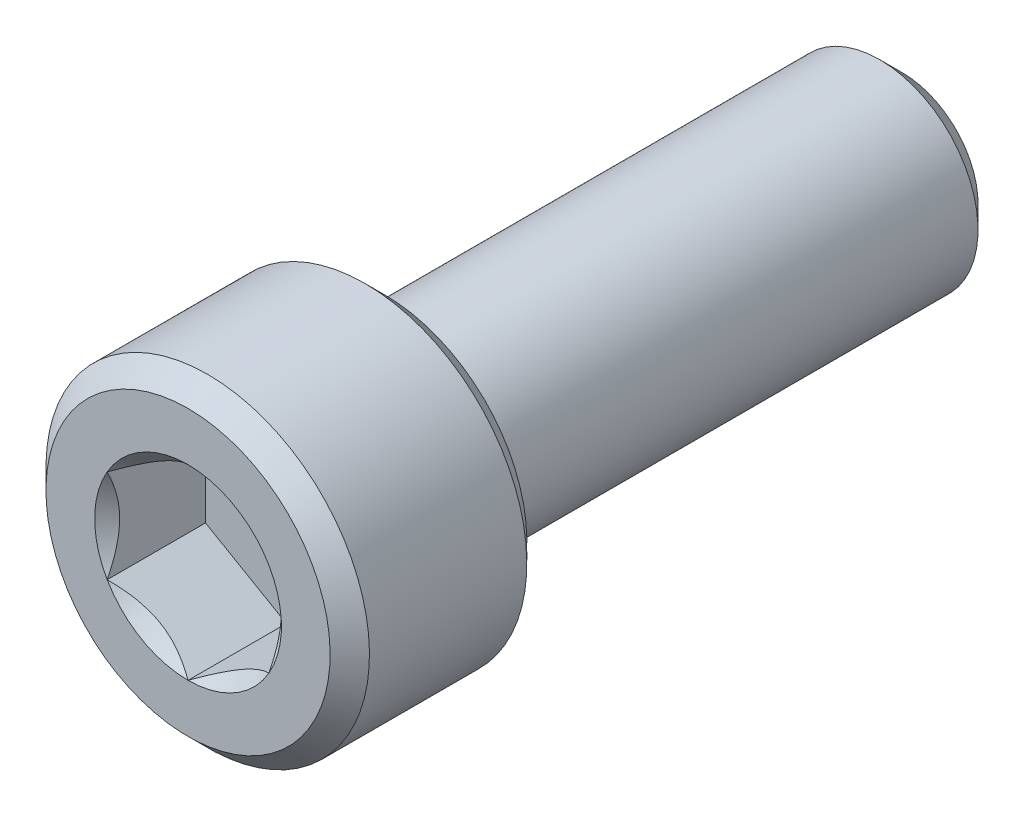
ISO-10303-21;
HEADER;
FILE_DESCRIPTION(('STEP AP214'),'2;1');
FILE_NAME('part.step','',(''),(''),'','','');
FILE_SCHEMA(('AUTOMOTIVE_DESIGN { 1 0 10303 214 1 1 1 1 }'));
ENDSEC;
DATA;
#1=APPLICATION_CONTEXT('core data for automotive mechanical design processes');
#2=APPLICATION_PROTOCOL_DEFINITION('international standard','automotive_design',2000,#1);
#3=PRODUCT_CONTEXT('',#1,'mechanical');
#4=PRODUCT('Part','Part','',(#3));
#5=PRODUCT_RELATED_PRODUCT_CATEGORY('part','',(#4));
#6=PRODUCT_DEFINITION_FORMATION('','',#4);
#7=PRODUCT_DEFINITION_CONTEXT('part definition',#1,'design');
#8=PRODUCT_DEFINITION('design','',#6,#7);
#9=PRODUCT_DEFINITION_SHAPE('','',#8);
#10=(LENGTH_UNIT() NAMED_UNIT(*) SI_UNIT(.MILLI.,.METRE.));
#11=(NAMED_UNIT(*) PLANE_ANGLE_UNIT() SI_UNIT($,.RADIAN.));
#12=(NAMED_UNIT(*) SI_UNIT($,.STERADIAN.) SOLID_ANGLE_UNIT());
#13=UNCERTAINTY_MEASURE_WITH_UNIT(LENGTH_MEASURE(1.E-05),#10,'distance_accuracy_value','');
#14=(GEOMETRIC_REPRESENTATION_CONTEXT(3) GLOBAL_UNCERTAINTY_ASSIGNED_CONTEXT((#13)) GLOBAL_UNIT_ASSIGNED_CONTEXT((#10,
#11,#12)) REPRESENTATION_CONTEXT('',''));
#15=CARTESIAN_POINT('',(0.,0.,0.));
#16=DIRECTION('',(0.,0.,1.));
#17=DIRECTION('',(1.,0.,0.));
#18=AXIS2_PLACEMENT_3D('',#15,#16,#17);
#19=CARTESIAN_POINT('',(0.,1.85737500000001,-8.763));
#20=DIRECTION('',(0.,0.,-1.));
#21=DIRECTION('',(0.,1.,0.));
#22=AXIS2_PLACEMENT_3D('',#19,#20,#21);
#23=PLANE('',#22);
#24=CARTESIAN_POINT('',(0.,0.,-8.76300000000001));
#25=DIRECTION('',(0.,0.,-1.));
#26=DIRECTION('',(0.,1.,0.));
#27=AXIS2_PLACEMENT_3D('',#24,#25,#26);
#28=CIRCLE('',#27,1.85737500000002);
#29=CARTESIAN_POINT('',(0.,1.85737500000001,-8.76300000000001));
#30=VERTEX_POINT('',#29);
#31=EDGE_CURVE('E202',#30,#30,#28,.T.);
#32=ORIENTED_EDGE('',*,*,#31,.T.);
#33=EDGE_LOOP('',(#32));
#34=FACE_BOUND('',#33,.T.);
#35=ADVANCED_FACE('F33',(#34),#23,.T.);
#36=CARTESIAN_POINT('',(0.,0.,8.763));
#37=DIRECTION('',(0.,0.,1.));
#38=DIRECTION('',(0.,-1.,0.));
#39=AXIS2_PLACEMENT_3D('',#36,#37,#38);
#40=PLANE('',#39);
#41=CARTESIAN_POINT('',(0.,0.,8.763));
#42=DIRECTION('',(0.,0.,1.));
#43=DIRECTION('',(1.,0.,0.));
#44=AXIS2_PLACEMENT_3D('',#41,#42,#43);
#45=CIRCLE('',#44,2.29135888084633);
#46=CARTESIAN_POINT('',(0.,-2.29135888084633,8.763));
#47=VERTEX_POINT('',#46);
#48=CARTESIAN_POINT('',(1.98437500000001,-1.14567944042315,8.763));
#49=VERTEX_POINT('',#48);
#50=EDGE_CURVE('E102',#47,#49,#45,.T.);
#51=ORIENTED_EDGE('',*,*,#50,.F.);
#52=CARTESIAN_POINT('',(-1.984375,-1.14567944042316,8.763));
#53=VERTEX_POINT('',#52);
#54=EDGE_CURVE('E92',#53,#47,#45,.T.);
#55=ORIENTED_EDGE('',*,*,#54,.F.);
#56=CARTESIAN_POINT('',(-1.984375,1.14567944042317,8.763));
#57=VERTEX_POINT('',#56);
#58=EDGE_CURVE('E101',#57,#53,#45,.T.);
#59=ORIENTED_EDGE('',*,*,#58,.F.);
#60=CARTESIAN_POINT('',(0.,2.29135888084633,8.763));
#61=VERTEX_POINT('',#60);
#62=EDGE_CURVE('E52',#61,#57,#45,.T.);
#63=ORIENTED_EDGE('',*,*,#62,.F.);
#64=CARTESIAN_POINT('',(1.984375,1.14567944042317,8.763));
#65=VERTEX_POINT('',#64);
#66=EDGE_CURVE('E59',#65,#61,#45,.T.);
#67=ORIENTED_EDGE('',*,*,#66,.F.);
#68=EDGE_CURVE('E130',#49,#65,#45,.T.);
#69=ORIENTED_EDGE('',*,*,#68,.F.);
#70=EDGE_LOOP('',(#51,#55,#59,#63,#67,#69));
#71=FACE_BOUND('',#70,.T.);
#72=CARTESIAN_POINT('',(0.,0.,8.763));
#73=DIRECTION('',(0.,0.,-1.));
#74=DIRECTION('',(0.,1.,0.));
#75=AXIS2_PLACEMENT_3D('',#72,#73,#74);
#76=CIRCLE('',#75,3.48615);
#77=CARTESIAN_POINT('',(0.,3.48614999999999,8.763));
#78=VERTEX_POINT('',#77);
#79=EDGE_CURVE('E46',#78,#78,#76,.T.);
#80=ORIENTED_EDGE('',*,*,#79,.F.);
#81=EDGE_LOOP('',(#80));
#82=FACE_BOUND('',#81,.T.);
#83=ADVANCED_FACE('F128',(#71,#82),#40,.T.);
#84=CARTESIAN_POINT('',(0.,0.,8.2804));
#85=DIRECTION('',(0.,0.,-1.));
#86=DIRECTION('',(0.,1.,0.));
#87=AXIS2_PLACEMENT_3D('',#84,#85,#86);
#88=CONICAL_SURFACE('',#87,3.96875,0.785398163397448);
#89=ORIENTED_EDGE('',*,*,#79,.T.);
#90=EDGE_LOOP('',(#89));
#91=FACE_BOUND('',#90,.T.);
#92=CARTESIAN_POINT('',(0.,0.,8.2804));
#93=DIRECTION('',(0.,0.,-1.));
#94=DIRECTION('',(0.,1.,0.));
#95=AXIS2_PLACEMENT_3D('',#92,#93,#94);
#96=CIRCLE('',#95,3.96875);
#97=CARTESIAN_POINT('',(0.,3.96874999999999,8.2804));
#98=VERTEX_POINT('',#97);
#99=EDGE_CURVE('E221',#98,#98,#96,.T.);
#100=ORIENTED_EDGE('',*,*,#99,.F.);
#101=EDGE_LOOP('',(#100));
#102=FACE_BOUND('',#101,.T.);
#103=ADVANCED_FACE('F199',(#91,#102),#88,.T.);
#104=CARTESIAN_POINT('',(0.,0.,-8.763));
#105=DIRECTION('',(0.,0.,-1.));
#106=DIRECTION('',(0.,1.,0.));
#107=AXIS2_PLACEMENT_3D('',#104,#105,#106);
#108=CYLINDRICAL_SURFACE('',#107,3.96875);
#109=ORIENTED_EDGE('',*,*,#99,.T.);
#110=EDGE_LOOP('',(#109));
#111=FACE_BOUND('',#110,.T.);
#112=CARTESIAN_POINT('',(0.,0.,4.4196));
#113=DIRECTION('',(0.,0.,-1.));
#114=DIRECTION('',(0.,1.,0.));
#115=AXIS2_PLACEMENT_3D('',#112,#113,#114);
#116=CIRCLE('',#115,3.96875);
#117=CARTESIAN_POINT('',(0.,3.96874999999999,4.4196));
#118=VERTEX_POINT('',#117);
#119=EDGE_CURVE('E218',#118,#118,#116,.T.);
#120=ORIENTED_EDGE('',*,*,#119,.F.);
#121=EDGE_LOOP('',(#120));
#122=FACE_BOUND('',#121,.T.);
#123=ADVANCED_FACE('F228',(#111,#122),#108,.T.);
#124=CARTESIAN_POINT('',(0.,0.,3.937));
#125=DIRECTION('',(0.,0.,1.));
#126=DIRECTION('',(0.,-1.,0.));
#127=AXIS2_PLACEMENT_3D('',#124,#125,#126);
#128=CONICAL_SURFACE('',#127,3.48614999999999,0.785398163397455);
#129=ORIENTED_EDGE('',*,*,#119,.T.);
#130=EDGE_LOOP('',(#129));
#131=FACE_BOUND('',#130,.T.);
#132=CARTESIAN_POINT('',(0.,0.,3.937));
#133=DIRECTION('',(0.,0.,-1.));
#134=DIRECTION('',(0.,1.,0.));
#135=AXIS2_PLACEMENT_3D('',#132,#133,#134);
#136=CIRCLE('',#135,3.48614999999999);
#137=CARTESIAN_POINT('',(0.,3.48614999999998,3.937));
#138=VERTEX_POINT('',#137);
#139=EDGE_CURVE('E215',#138,#138,#136,.T.);
#140=ORIENTED_EDGE('',*,*,#139,.F.);
#141=EDGE_LOOP('',(#140));
#142=FACE_BOUND('',#141,.T.);
#143=ADVANCED_FACE('F234',(#131,#142),#128,.T.);
#144=CARTESIAN_POINT('',(0.,3.48614999999998,3.937));
#145=DIRECTION('',(0.,0.,-1.));
#146=DIRECTION('',(0.,1.,0.));
#147=AXIS2_PLACEMENT_3D('',#144,#145,#146);
#148=PLANE('',#147);
#149=ORIENTED_EDGE('',*,*,#139,.T.);
#150=EDGE_LOOP('',(#149));
#151=FACE_BOUND('',#150,.T.);
#152=CARTESIAN_POINT('',(0.,0.,3.937));
#153=DIRECTION('',(0.,0.,-1.));
#154=DIRECTION('',(0.,1.,0.));
#155=AXIS2_PLACEMENT_3D('',#152,#153,#154);
#156=CIRCLE('',#155,2.41300000000001);
#157=CARTESIAN_POINT('',(0.,2.41300000000001,3.937));
#158=VERTEX_POINT('',#157);
#159=EDGE_CURVE('E207',#158,#158,#156,.T.);
#160=ORIENTED_EDGE('',*,*,#159,.F.);
#161=EDGE_LOOP('',(#160));
#162=FACE_BOUND('',#161,.T.);
#163=ADVANCED_FACE('F240',(#151,#162),#148,.T.);
#164=CARTESIAN_POINT('',(0.,0.,-8.763));
#165=DIRECTION('',(0.,0.,-1.));
#166=DIRECTION('',(0.,1.,0.));
#167=AXIS2_PLACEMENT_3D('',#164,#165,#166);
#168=CYLINDRICAL_SURFACE('',#167,2.41300000000001);
#169=ORIENTED_EDGE('',*,*,#159,.T.);
#170=EDGE_LOOP('',(#169));
#171=FACE_BOUND('',#170,.T.);
#172=CARTESIAN_POINT('',(0.,0.,-8.20737500000002));
#173=DIRECTION('',(0.,0.,-1.));
#174=DIRECTION('',(0.,1.,0.));
#175=AXIS2_PLACEMENT_3D('',#172,#173,#174);
#176=CIRCLE('',#175,2.41300000000001);
#177=CARTESIAN_POINT('',(0.,2.41300000000001,-8.20737500000002));
#178=VERTEX_POINT('',#177);
#179=EDGE_CURVE('E204',#178,#178,#176,.T.);
#180=ORIENTED_EDGE('',*,*,#179,.F.);
#181=EDGE_LOOP('',(#180));
#182=FACE_BOUND('',#181,.T.);
#183=ADVANCED_FACE('F246',(#171,#182),#168,.T.);
#184=CARTESIAN_POINT('',(0.,0.,-8.76300000000001));
#185=DIRECTION('',(0.,0.,1.));
#186=DIRECTION('',(0.,-1.,0.));
#187=AXIS2_PLACEMENT_3D('',#184,#185,#186);
#188=CONICAL_SURFACE('',#187,1.85737500000002,0.785398163397456);
#189=ORIENTED_EDGE('',*,*,#179,.T.);
#190=EDGE_LOOP('',(#189));
#191=FACE_BOUND('',#190,.T.);
#192=ORIENTED_EDGE('',*,*,#31,.F.);
#193=EDGE_LOOP('',(#192));
#194=FACE_BOUND('',#193,.T.);
#195=ADVANCED_FACE('F252',(#191,#194),#188,.T.);
#196=CARTESIAN_POINT('',(0.,0.,8.763));
#197=DIRECTION('',(0.,0.,1.));
#198=DIRECTION('',(1.,0.,0.));
#199=AXIS2_PLACEMENT_3D('',#196,#197,#198);
#200=CONICAL_SURFACE('',#199,2.29135888084633,0.78539816339745);
#201=ORIENTED_EDGE('',*,*,#50,.T.);
#202=CARTESIAN_POINT('',(-0.000199999999999756,-2.29147435090016,8.76311547878183));
#203=CARTESIAN_POINT('',(0.0680159951668026,-2.25208982772757,8.7237628522639));
#204=CARTESIAN_POINT('',(0.137372685106966,-2.21204672412051,8.68672131044618));
#205=CARTESIAN_POINT('',(0.278798800452187,-2.13039431835551,8.61889885842331));
#206=CARTESIAN_POINT('',(0.350881678736782,-2.08877724917393,8.58815568909174));
#207=CARTESIAN_POINT('',(0.496233397266003,-2.00485839535391,8.5354918888112));
#208=CARTESIAN_POINT('',(0.569465212486937,-1.96257798712286,8.51343887587996));
#209=CARTESIAN_POINT('',(0.717541182594705,-1.87708628592063,8.47946149294387));
#210=CARTESIAN_POINT('',(0.792380812753423,-1.83387760530244,8.46751175609172));
#211=CARTESIAN_POINT('',(0.921360414543814,-1.75941119748879,8.4567300990819));
#212=CARTESIAN_POINT('',(0.975333715772441,-1.72824969749539,8.45513389905906));
#213=CARTESIAN_POINT('',(1.0831921185198,-1.66597761963484,8.45782183886528));
#214=CARTESIAN_POINT('',(1.13707718248552,-1.63486706344893,8.46210804034045));
#215=CARTESIAN_POINT('',(1.2443385382486,-1.57293969082547,8.47631687301351));
#216=CARTESIAN_POINT('',(1.29771419276014,-1.54212324232506,8.48624581045226));
#217=CARTESIAN_POINT('',(1.40354251740889,-1.48102323060121,8.51119508427453));
#218=CARTESIAN_POINT('',(1.4559952579711,-1.45073962671789,8.52621503038948));
#219=CARTESIAN_POINT('',(1.59035733896365,-1.37316564308797,8.57080785163566));
#220=CARTESIAN_POINT('',(1.67143335715832,-1.32635638215845,8.60374299593832));
#221=CARTESIAN_POINT('',(1.79064830672984,-1.2575275989319,8.65934244120219));
#222=CARTESIAN_POINT('',(1.829934924386,-1.23484545965257,8.67887759205185));
#223=CARTESIAN_POINT('',(1.90778036186805,-1.18990137536712,8.71972873811939));
#224=CARTESIAN_POINT('',(1.9463396111017,-1.16763918244233,8.74104363956834));
#225=CARTESIAN_POINT('',(1.984575,-1.14556397036932,8.76311547878183));
#226=B_SPLINE_CURVE_WITH_KNOTS('',3,(#202,#203,#204,#205,#206,#207,#208,#209,#210,#211,#212,
#213,#214,#215,#216,#217,#218,#219,#220,#221,#222,#223,#224,#225),.UNSPECIFIED.,.F.,.F.,(4,2,2,
2,2,2,2,2,2,2,2,4),(0.,0.264339630306625,0.530219665093692,0.791876416371458,1.05287424418109,
1.239639843932,1.42647091743852,1.61351120244034,1.8005371524754,2.09764209964316,
2.24579179873713,2.39385111134157),.UNSPECIFIED.);
#227=EDGE_CURVE('E11',#47,#49,#226,.T.);
#228=ORIENTED_EDGE('',*,*,#227,.F.);
#229=EDGE_LOOP('',(#201,#228));
#230=FACE_BOUND('',#229,.T.);
#231=ADVANCED_FACE('F106',(#230),#200,.F.);
#232=ORIENTED_EDGE('',*,*,#68,.T.);
#233=CARTESIAN_POINT('',(1.984375,-2.28495242157822,9.49798407881656));
#234=CARTESIAN_POINT('',(1.984375,-2.22931635455401,9.45598668555075));
#235=CARTESIAN_POINT('',(1.984375,-2.17336876548389,9.41439605407633));
#236=CARTESIAN_POINT('',(1.984375,-2.0607277025817,9.33220846147147));
#237=CARTESIAN_POINT('',(1.984375,-2.00403404503434,9.29161175240503));
#238=CARTESIAN_POINT('',(1.984375,-1.88936329173488,9.21130350317466));
#239=CARTESIAN_POINT('',(1.984375,-1.83137965519348,9.1716012588133));
#240=CARTESIAN_POINT('',(1.984375,-1.7144280213784,9.09368517340128));
#241=CARTESIAN_POINT('',(1.984375,-1.65546009407227,9.05547122719436));
#242=CARTESIAN_POINT('',(1.984375,-1.47005472306035,8.93925283401363));
#243=CARTESIAN_POINT('',(1.984375,-1.34163909427883,8.86434788687237));
#244=CARTESIAN_POINT('',(1.984375,-1.07840384705479,8.72733021543973));
#245=CARTESIAN_POINT('',(1.984375,-0.943607781407422,8.66517436648237));
#246=CARTESIAN_POINT('',(1.984375,-0.741275100444879,8.58913257868861));
#247=CARTESIAN_POINT('',(1.984375,-0.676735408881093,8.567308061326));
#248=CARTESIAN_POINT('',(1.984375,-0.546098118112759,8.52884046353779));
#249=CARTESIAN_POINT('',(1.984375,-0.480000411919953,8.51219774006555));
#250=CARTESIAN_POINT('',(1.984375,-0.347746170028529,8.48523538086972));
#251=CARTESIAN_POINT('',(1.984375,-0.28161207147912,8.47480740973589));
#252=CARTESIAN_POINT('',(1.984375,-0.148636620052348,8.46047814737659));
#253=CARTESIAN_POINT('',(1.984375,-0.0817953907393215,8.45657573422738));
#254=CARTESIAN_POINT('',(1.984375,0.0495156750890664,8.45558705133267));
#255=CARTESIAN_POINT('',(1.984375,0.113983775102993,8.45825917887501));
#256=CARTESIAN_POINT('',(1.984375,0.242367515846179,8.46973921049751));
#257=CARTESIAN_POINT('',(1.984375,0.306283102295921,8.47854771063921));
#258=CARTESIAN_POINT('',(1.984375,0.434181040262186,8.50196902133289));
#259=CARTESIAN_POINT('',(1.984375,0.498145026858311,8.51668060623208));
#260=CARTESIAN_POINT('',(1.984375,0.624675616953008,8.55112618141212));
#261=CARTESIAN_POINT('',(1.984375,0.68724233689969,8.57085975144919));
#262=CARTESIAN_POINT('',(1.984375,0.884225483826088,8.64041223723076));
#263=CARTESIAN_POINT('',(1.984375,1.01583674256468,8.69815241125649));
#264=CARTESIAN_POINT('',(1.984375,1.27288659242652,8.82653033658879));
#265=CARTESIAN_POINT('',(1.984375,1.3983008827048,8.89721442491941));
#266=CARTESIAN_POINT('',(1.984375,1.57956687990221,9.0075166638132));
#267=CARTESIAN_POINT('',(1.984375,1.63738271299424,9.04396982947536));
#268=CARTESIAN_POINT('',(1.984375,1.75202215386202,9.1184159632917));
#269=CARTESIAN_POINT('',(1.984375,1.80884568601362,9.15640904807805));
#270=CARTESIAN_POINT('',(1.984375,1.92116923084256,9.23333880889309));
#271=CARTESIAN_POINT('',(1.984375,1.97667624512254,9.27226531303879));
#272=CARTESIAN_POINT('',(1.984375,2.08693170717167,9.35114774612139));
#273=CARTESIAN_POINT('',(1.984375,2.14168035934793,9.39110338902403));
#274=CARTESIAN_POINT('',(1.984375,2.19611149046623,9.43148061128543));
#275=B_SPLINE_CURVE_WITH_KNOTS('',3,(#233,#234,#235,#236,#237,#238,#239,#240,#241,#242,#243,
#244,#245,#246,#247,#248,#249,#250,#251,#252,#253,#254,#255,#256,#257,#258,#259,#260,#261,#262,
#263,#264,#265,#266,#267,#268,#269,#270,#271,#272,#273,#274),.UNSPECIFIED.,.F.,.F.,(4,2,2,2,2,2,
2,2,2,2,2,2,2,2,2,2,2,2,2,2,4),(0.,0.209126070008321,0.418304637356569,0.62910397997799,
0.839888401371182,1.28549951116127,1.72957750768351,1.93379389749971,2.13802435186698,
2.33858179514333,2.53910475350638,2.73236963400794,2.92565329006886,3.12231577097487,
3.31896180041344,3.74886295245171,4.18033428125362,4.3853601718029,4.59040161996382,
4.79377749165107,4.99709743524131),.UNSPECIFIED.);
#276=EDGE_CURVE('E132',#49,#65,#275,.T.);
#277=ORIENTED_EDGE('',*,*,#276,.F.);
#278=EDGE_LOOP('',(#232,#277));
#279=FACE_BOUND('',#278,.T.);
#280=ADVANCED_FACE('F261',(#279),#200,.F.);
#281=ORIENTED_EDGE('',*,*,#66,.T.);
#282=CARTESIAN_POINT('',(1.984575,1.14556397036933,8.76311547878184));
#283=CARTESIAN_POINT('',(1.9163590048332,1.18494849354193,8.72376285226392));
#284=CARTESIAN_POINT('',(1.84700231489303,1.22499159714898,8.68672131044618));
#285=CARTESIAN_POINT('',(1.70557619954781,1.30664400291399,8.61889885842332));
#286=CARTESIAN_POINT('',(1.63349332126322,1.34826107209556,8.58815568909176));
#287=CARTESIAN_POINT('',(1.488141602734,1.43217992591558,8.53549188881122));
#288=CARTESIAN_POINT('',(1.41490978751306,1.47446033414663,8.51343887587996));
#289=CARTESIAN_POINT('',(1.26683381740529,1.55995203534887,8.47946149294388));
#290=CARTESIAN_POINT('',(1.19199418724658,1.60316071596706,8.46751175609173));
#291=CARTESIAN_POINT('',(1.06301458545618,1.67762712378071,8.45673009908191));
#292=CARTESIAN_POINT('',(1.00904128422756,1.70878862377411,8.45513389905907));
#293=CARTESIAN_POINT('',(0.901182881480199,1.77106070163466,8.4578218388653));
#294=CARTESIAN_POINT('',(0.847297817514476,1.80217125782057,8.46210804034046));
#295=CARTESIAN_POINT('',(0.740036461751395,1.86409863044403,8.47631687301352));
#296=CARTESIAN_POINT('',(0.686660807239859,1.89491507894444,8.48624581045228));
#297=CARTESIAN_POINT('',(0.580832482591102,1.95601509066828,8.51119508427454));
#298=CARTESIAN_POINT('',(0.528379742028897,1.98629869455161,8.52621503038949));
#299=CARTESIAN_POINT('',(0.39401766103635,2.06387267818153,8.57080785163567));
#300=CARTESIAN_POINT('',(0.312941642841675,2.11068193911105,8.60374299593834));
#301=CARTESIAN_POINT('',(0.193726693270161,2.17951072233759,8.6593424412022));
#302=CARTESIAN_POINT('',(0.154440075614,2.20219286161693,8.67887759205187));
#303=CARTESIAN_POINT('',(0.0765946381319484,2.24713694590237,8.71972873811941));
#304=CARTESIAN_POINT('',(0.0380353888983027,2.26939913882717,8.74104363956835));
#305=CARTESIAN_POINT('',(-0.000199999999998523,2.29147435090017,8.76311547878185));
#306=B_SPLINE_CURVE_WITH_KNOTS('',3,(#282,#283,#284,#285,#286,#287,#288,#289,#290,#291,#292,
#293,#294,#295,#296,#297,#298,#299,#300,#301,#302,#303,#304,#305),.UNSPECIFIED.,.F.,.F.,(4,2,2,
2,2,2,2,2,2,2,2,4),(0.,0.264339630306626,0.530219665093693,0.791876416371459,1.05287424418109,
1.239639843932,1.42647091743852,1.61351120244035,1.8005371524754,2.09764209964316,
2.24579179873713,2.39385111134157),.UNSPECIFIED.);
#307=EDGE_CURVE('E140',#65,#61,#306,.T.);
#308=ORIENTED_EDGE('',*,*,#307,.F.);
#309=EDGE_LOOP('',(#281,#308));
#310=FACE_BOUND('',#309,.T.);
#311=ADVANCED_FACE('F303',(#310),#200,.F.);
#312=ORIENTED_EDGE('',*,*,#62,.T.);
#313=CARTESIAN_POINT('',(0.000200000000001233,2.29147435090017,8.76311547878185));
#314=CARTESIAN_POINT('',(-0.0680159951668012,2.25208982772758,8.72376285226392));
#315=CARTESIAN_POINT('',(-0.137372685106965,2.21204672412053,8.68672131044619));
#316=CARTESIAN_POINT('',(-0.278798800452187,2.13039431835552,8.61889885842333));
#317=CARTESIAN_POINT('',(-0.350881678736783,2.08877724917394,8.58815568909176));
#318=CARTESIAN_POINT('',(-0.496233397266005,2.00485839535392,8.53549188881122));
#319=CARTESIAN_POINT('',(-0.56946521248694,1.96257798712287,8.51343887587996));
#320=CARTESIAN_POINT('',(-0.717541182594708,1.87708628592064,8.47946149294388));
#321=CARTESIAN_POINT('',(-0.792380812753426,1.83387760530245,8.46751175609173));
#322=CARTESIAN_POINT('',(-0.921360414543817,1.75941119748879,8.45673009908191));
#323=CARTESIAN_POINT('',(-0.975333715772444,1.72824969749539,8.45513389905907));
#324=CARTESIAN_POINT('',(-1.0831921185198,1.66597761963484,8.45782183886529));
#325=CARTESIAN_POINT('',(-1.13707718248553,1.63486706344893,8.46210804034046));
#326=CARTESIAN_POINT('',(-1.24433853824861,1.57293969082547,8.47631687301352));
#327=CARTESIAN_POINT('',(-1.29771419276014,1.54212324232507,8.48624581045227));
#328=CARTESIAN_POINT('',(-1.4035425174089,1.48102323060122,8.51119508427454));
#329=CARTESIAN_POINT('',(-1.45599525797111,1.4507396267179,8.52621503038949));
#330=CARTESIAN_POINT('',(-1.59035733896365,1.37316564308797,8.57080785163567));
#331=CARTESIAN_POINT('',(-1.67143335715833,1.32635638215845,8.60374299593833));
#332=CARTESIAN_POINT('',(-1.79064830672984,1.25752759893191,8.6593424412022));
#333=CARTESIAN_POINT('',(-1.829934924386,1.23484545965258,8.67887759205186));
#334=CARTESIAN_POINT('',(-1.90778036186805,1.18990137536713,8.7197287381194));
#335=CARTESIAN_POINT('',(-1.9463396111017,1.16763918244234,8.74104363956835));
#336=CARTESIAN_POINT('',(-1.984575,1.14556397036933,8.76311547878184));
#337=B_SPLINE_CURVE_WITH_KNOTS('',3,(#313,#314,#315,#316,#317,#318,#319,#320,#321,#322,#323,
#324,#325,#326,#327,#328,#329,#330,#331,#332,#333,#334,#335,#336),.UNSPECIFIED.,.F.,.F.,(4,2,2,
2,2,2,2,2,2,2,2,4),(0.,0.264339630306627,0.530219665093697,0.791876416371464,1.05287424418109,
1.23963984393201,1.42647091743853,1.61351120244035,1.80053715247541,2.09764209964317,
2.24579179873714,2.39385111134157),.UNSPECIFIED.);
#338=EDGE_CURVE('E160',#61,#57,#337,.T.);
#339=ORIENTED_EDGE('',*,*,#338,.F.);
#340=EDGE_LOOP('',(#312,#339));
#341=FACE_BOUND('',#340,.T.);
#342=ADVANCED_FACE('F299',(#341),#200,.F.);
#343=ORIENTED_EDGE('',*,*,#58,.T.);
#344=CARTESIAN_POINT('',(-1.984375,-2.28495242157822,9.49798407881656));
#345=CARTESIAN_POINT('',(-1.984375,-2.22931635455402,9.45598668555076));
#346=CARTESIAN_POINT('',(-1.984375,-2.17336876548389,9.41439605407633));
#347=CARTESIAN_POINT('',(-1.984375,-2.06072770258171,9.33220846147147));
#348=CARTESIAN_POINT('',(-1.984375,-2.00403404503435,9.29161175240504));
#349=CARTESIAN_POINT('',(-1.984375,-1.88936329173489,9.21130350317466));
#350=CARTESIAN_POINT('',(-1.984375,-1.83137965519348,9.1716012588133));
#351=CARTESIAN_POINT('',(-1.984375,-1.7144280213784,9.09368517340129));
#352=CARTESIAN_POINT('',(-1.984375,-1.65546009407228,9.05547122719436));
#353=CARTESIAN_POINT('',(-1.984375,-1.47005472306035,8.93925283401363));
#354=CARTESIAN_POINT('',(-1.984375,-1.34163909427883,8.86434788687238));
#355=CARTESIAN_POINT('',(-1.984375,-1.0784038470548,8.72733021543973));
#356=CARTESIAN_POINT('',(-1.984375,-0.943607781407425,8.66517436648237));
#357=CARTESIAN_POINT('',(-1.984375,-0.741275100444882,8.58913257868861));
#358=CARTESIAN_POINT('',(-1.984375,-0.676735408881095,8.567308061326));
#359=CARTESIAN_POINT('',(-1.984375,-0.546098118112762,8.52884046353779));
#360=CARTESIAN_POINT('',(-1.984375,-0.480000411919956,8.51219774006554));
#361=CARTESIAN_POINT('',(-1.984375,-0.347746170028532,8.48523538086972));
#362=CARTESIAN_POINT('',(-1.984375,-0.281612071479123,8.47480740973589));
#363=CARTESIAN_POINT('',(-1.984375,-0.148636620052351,8.46047814737659));
#364=CARTESIAN_POINT('',(-1.984375,-0.081795390739325,8.45657573422738));
#365=CARTESIAN_POINT('',(-1.984375,0.0495156750890627,8.45558705133267));
#366=CARTESIAN_POINT('',(-1.984375,0.11398377510299,8.45825917887501));
#367=CARTESIAN_POINT('',(-1.984375,0.242367515846175,8.46973921049751));
#368=CARTESIAN_POINT('',(-1.984375,0.306283102295917,8.47854771063921));
#369=CARTESIAN_POINT('',(-1.984375,0.434181040262182,8.50196902133289));
#370=CARTESIAN_POINT('',(-1.984375,0.498145026858307,8.51668060623208));
#371=CARTESIAN_POINT('',(-1.984375,0.624675616953005,8.55112618141212));
#372=CARTESIAN_POINT('',(-1.984375,0.687242336899686,8.57085975144919));
#373=CARTESIAN_POINT('',(-1.984375,0.884225483826086,8.64041223723075));
#374=CARTESIAN_POINT('',(-1.984375,1.01583674256468,8.69815241125649));
#375=CARTESIAN_POINT('',(-1.984375,1.27288659242652,8.82653033658879));
#376=CARTESIAN_POINT('',(-1.984375,1.3983008827048,8.89721442491941));
#377=CARTESIAN_POINT('',(-1.984375,1.57956687990221,9.00751666381319));
#378=CARTESIAN_POINT('',(-1.984375,1.63738271299424,9.04396982947536));
#379=CARTESIAN_POINT('',(-1.984375,1.75202215386201,9.1184159632917));
#380=CARTESIAN_POINT('',(-1.984375,1.80884568601361,9.15640904807805));
#381=CARTESIAN_POINT('',(-1.984375,1.92116923084255,9.23333880889309));
#382=CARTESIAN_POINT('',(-1.984375,1.97667624512253,9.27226531303879));
#383=CARTESIAN_POINT('',(-1.984375,2.08693170717166,9.35114774612138));
#384=CARTESIAN_POINT('',(-1.984375,2.14168035934792,9.39110338902402));
#385=CARTESIAN_POINT('',(-1.984375,2.19611149046622,9.43148061128542));
#386=B_SPLINE_CURVE_WITH_KNOTS('',3,(#344,#345,#346,#347,#348,#349,#350,#351,#352,#353,#354,
#355,#356,#357,#358,#359,#360,#361,#362,#363,#364,#365,#366,#367,#368,#369,#370,#371,#372,#373,
#374,#375,#376,#377,#378,#379,#380,#381,#382,#383,#384,#385),.UNSPECIFIED.,.F.,.F.,(4,2,2,2,2,2,
2,2,2,2,2,2,2,2,2,2,2,2,2,2,4),(0.,0.209126070008322,0.418304637356568,0.629103979977991,
0.839888401371183,1.28549951116127,1.72957750768351,1.93379389749971,2.13802435186698,
2.33858179514333,2.53910475350639,2.73236963400794,2.92565329006886,3.12231577097487,
3.31896180041345,3.74886295245172,4.18033428125362,4.3853601718029,4.59040161996382,
4.79377749165107,4.99709743524131),.UNSPECIFIED.);
#387=EDGE_CURVE('E118',#57,#53,#386,.F.);
#388=ORIENTED_EDGE('',*,*,#387,.F.);
#389=EDGE_LOOP('',(#343,#388));
#390=FACE_BOUND('',#389,.T.);
#391=ADVANCED_FACE('F153',(#390),#200,.F.);
#392=ORIENTED_EDGE('',*,*,#54,.T.);
#393=CARTESIAN_POINT('',(-1.984575,-1.14556397036932,8.76311547878183));
#394=CARTESIAN_POINT('',(-1.9163590048332,-1.18494849354192,8.72376285226391));
#395=CARTESIAN_POINT('',(-1.84700231489303,-1.22499159714897,8.68672131044618));
#396=CARTESIAN_POINT('',(-1.70557619954781,-1.30664400291398,8.61889885842331));
#397=CARTESIAN_POINT('',(-1.63349332126322,-1.34826107209555,8.58815568909175));
#398=CARTESIAN_POINT('',(-1.48814160273399,-1.43217992591557,8.53549188881121));
#399=CARTESIAN_POINT('',(-1.41490978751306,-1.47446033414662,8.51343887587996));
#400=CARTESIAN_POINT('',(-1.26683381740529,-1.55995203534886,8.47946149294387));
#401=CARTESIAN_POINT('',(-1.19199418724657,-1.60316071596705,8.46751175609172));
#402=CARTESIAN_POINT('',(-1.06301458545618,-1.6776271237807,8.4567300990819));
#403=CARTESIAN_POINT('',(-1.00904128422756,-1.7087886237741,8.45513389905906));
#404=CARTESIAN_POINT('',(-0.901182881480198,-1.77106070163465,8.45782183886528));
#405=CARTESIAN_POINT('',(-0.847297817514475,-1.80217125782056,8.46210804034045));
#406=CARTESIAN_POINT('',(-0.740036461751395,-1.86409863044402,8.47631687301351));
#407=CARTESIAN_POINT('',(-0.686660807239859,-1.89491507894443,8.48624581045226));
#408=CARTESIAN_POINT('',(-0.580832482591103,-1.95601509066827,8.51119508427453));
#409=CARTESIAN_POINT('',(-0.528379742028898,-1.98629869455159,8.52621503038948));
#410=CARTESIAN_POINT('',(-0.394017661036351,-2.06387267818152,8.57080785163566));
#411=CARTESIAN_POINT('',(-0.312941642841675,-2.11068193911104,8.60374299593832));
#412=CARTESIAN_POINT('',(-0.19372669327016,-2.17951072233758,8.65934244120219));
#413=CARTESIAN_POINT('',(-0.154440075613999,-2.20219286161691,8.67887759205185));
#414=CARTESIAN_POINT('',(-0.0765946381319475,-2.24713694590236,8.71972873811939));
#415=CARTESIAN_POINT('',(-0.0380353888983018,-2.26939913882716,8.74104363956834));
#416=CARTESIAN_POINT('',(0.000199999999999851,-2.29147435090016,8.76311547878183));
#417=B_SPLINE_CURVE_WITH_KNOTS('',3,(#393,#394,#395,#396,#397,#398,#399,#400,#401,#402,#403,
#404,#405,#406,#407,#408,#409,#410,#411,#412,#413,#414,#415,#416),.UNSPECIFIED.,.F.,.F.,(4,2,2,
2,2,2,2,2,2,2,2,4),(0.,0.264339630306627,0.530219665093695,0.791876416371461,1.05287424418109,
1.239639843932,1.42647091743852,1.61351120244035,1.8005371524754,2.09764209964316,
2.24579179873713,2.39385111134157),.UNSPECIFIED.);
#418=EDGE_CURVE('E96',#53,#47,#417,.T.);
#419=ORIENTED_EDGE('',*,*,#418,.F.);
#420=EDGE_LOOP('',(#392,#419));
#421=FACE_BOUND('',#420,.T.);
#422=ADVANCED_FACE('F94',(#421),#200,.F.);
#423=CARTESIAN_POINT('',(0.,0.,6.35));
#424=DIRECTION('',(0.,0.,1.));
#425=DIRECTION('',(1.,0.,0.));
#426=AXIS2_PLACEMENT_3D('',#423,#424,#425);
#427=PLANE('',#426);
#428=DIRECTION('',(0.866025403784439,-0.499999999999999,0.));
#429=VECTOR('',#428,1.);
#430=CARTESIAN_POINT('',(-1.984375,-1.14567944042316,6.35));
#431=LINE('',#430,#429);
#432=CARTESIAN_POINT('',(-1.984375,-1.14567944042316,6.35));
#433=VERTEX_POINT('',#432);
#434=CARTESIAN_POINT('',(0.,-2.29135888084632,6.35));
#435=VERTEX_POINT('',#434);
#436=EDGE_CURVE('E117',#433,#435,#431,.T.);
#437=ORIENTED_EDGE('',*,*,#436,.T.);
#438=DIRECTION('',(0.866025403784439,0.5,0.));
#439=VECTOR('',#438,1.);
#440=CARTESIAN_POINT('',(0.,-2.29135888084632,6.35));
#441=LINE('',#440,#439);
#442=CARTESIAN_POINT('',(1.984375,-1.14567944042316,6.35));
#443=VERTEX_POINT('',#442);
#444=EDGE_CURVE('E122',#435,#443,#441,.T.);
#445=ORIENTED_EDGE('',*,*,#444,.T.);
#446=DIRECTION('',(0.,1.,0.));
#447=VECTOR('',#446,1.);
#448=CARTESIAN_POINT('',(1.984375,-1.14567944042316,6.35));
#449=LINE('',#448,#447);
#450=CARTESIAN_POINT('',(1.984375,1.14567944042317,6.35));
#451=VERTEX_POINT('',#450);
#452=EDGE_CURVE('E276',#443,#451,#449,.T.);
#453=ORIENTED_EDGE('',*,*,#452,.T.);
#454=DIRECTION('',(-0.866025403784439,0.5,0.));
#455=VECTOR('',#454,1.);
#456=CARTESIAN_POINT('',(1.984375,1.14567944042317,6.35));
#457=LINE('',#456,#455);
#458=CARTESIAN_POINT('',(0.,2.29135888084633,6.35));
#459=VERTEX_POINT('',#458);
#460=EDGE_CURVE('E280',#451,#459,#457,.T.);
#461=ORIENTED_EDGE('',*,*,#460,.T.);
#462=DIRECTION('',(-0.866025403784438,-0.5,0.));
#463=VECTOR('',#462,1.);
#464=CARTESIAN_POINT('',(0.,2.29135888084633,6.35));
#465=LINE('',#464,#463);
#466=CARTESIAN_POINT('',(-1.984375,1.14567944042317,6.35));
#467=VERTEX_POINT('',#466);
#468=EDGE_CURVE('E283',#459,#467,#465,.T.);
#469=ORIENTED_EDGE('',*,*,#468,.T.);
#470=DIRECTION('',(0.,-1.,0.));
#471=VECTOR('',#470,1.);
#472=CARTESIAN_POINT('',(-1.984375,1.14567944042317,6.35));
#473=LINE('',#472,#471);
#474=EDGE_CURVE('E125',#467,#433,#473,.T.);
#475=ORIENTED_EDGE('',*,*,#474,.T.);
#476=EDGE_LOOP('',(#437,#445,#453,#461,#469,#475));
#477=FACE_BOUND('',#476,.T.);
#478=ADVANCED_FACE('F152',(#477),#427,.T.);
#479=CARTESIAN_POINT('',(0.,-2.29135888084632,6.35));
#480=DIRECTION('',(0.5,-0.866025403784439,0.));
#481=DIRECTION('',(0.866025403784439,0.5,0.));
#482=AXIS2_PLACEMENT_3D('',#479,#480,#481);
#483=PLANE('',#482);
#484=DIRECTION('',(0.,0.,1.));
#485=VECTOR('',#484,1.);
#486=CARTESIAN_POINT('',(0.,-2.29135888084632,6.35));
#487=LINE('',#486,#485);
#488=EDGE_CURVE('E113',#435,#47,#487,.T.);
#489=ORIENTED_EDGE('',*,*,#488,.T.);
#490=ORIENTED_EDGE('',*,*,#227,.T.);
#491=DIRECTION('',(0.,0.,1.));
#492=VECTOR('',#491,1.);
#493=CARTESIAN_POINT('',(1.984375,-1.14567944042316,6.35));
#494=LINE('',#493,#492);
#495=EDGE_CURVE('E124',#443,#49,#494,.T.);
#496=ORIENTED_EDGE('',*,*,#495,.F.);
#497=ORIENTED_EDGE('',*,*,#444,.F.);
#498=EDGE_LOOP('',(#489,#490,#496,#497));
#499=FACE_BOUND('',#498,.T.);
#500=ADVANCED_FACE('F120',(#499),#483,.F.);
#501=CARTESIAN_POINT('',(1.984375,-1.14567944042316,6.35));
#502=DIRECTION('',(1.,0.,0.));
#503=DIRECTION('',(0.,0.,-1.));
#504=AXIS2_PLACEMENT_3D('',#501,#502,#503);
#505=PLANE('',#504);
#506=ORIENTED_EDGE('',*,*,#495,.T.);
#507=ORIENTED_EDGE('',*,*,#276,.T.);
#508=DIRECTION('',(0.,0.,1.));
#509=VECTOR('',#508,1.);
#510=CARTESIAN_POINT('',(1.984375,1.14567944042317,6.35));
#511=LINE('',#510,#509);
#512=EDGE_CURVE('E291',#451,#65,#511,.T.);
#513=ORIENTED_EDGE('',*,*,#512,.F.);
#514=ORIENTED_EDGE('',*,*,#452,.F.);
#515=EDGE_LOOP('',(#506,#507,#513,#514));
#516=FACE_BOUND('',#515,.T.);
#517=ADVANCED_FACE('F147',(#516),#505,.F.);
#518=CARTESIAN_POINT('',(1.984375,1.14567944042317,6.35));
#519=DIRECTION('',(0.5,0.866025403784439,0.));
#520=DIRECTION('',(-0.866025403784439,0.5,0.));
#521=AXIS2_PLACEMENT_3D('',#518,#519,#520);
#522=PLANE('',#521);
#523=ORIENTED_EDGE('',*,*,#512,.T.);
#524=ORIENTED_EDGE('',*,*,#307,.T.);
#525=DIRECTION('',(0.,0.,1.));
#526=VECTOR('',#525,1.);
#527=CARTESIAN_POINT('',(0.,2.29135888084633,6.35));
#528=LINE('',#527,#526);
#529=EDGE_CURVE('E288',#459,#61,#528,.T.);
#530=ORIENTED_EDGE('',*,*,#529,.F.);
#531=ORIENTED_EDGE('',*,*,#460,.F.);
#532=EDGE_LOOP('',(#523,#524,#530,#531));
#533=FACE_BOUND('',#532,.T.);
#534=ADVANCED_FACE('F184',(#533),#522,.F.);
#535=CARTESIAN_POINT('',(0.,2.29135888084633,6.35));
#536=DIRECTION('',(-0.5,0.866025403784438,0.));
#537=DIRECTION('',(-0.866025403784438,-0.5,0.));
#538=AXIS2_PLACEMENT_3D('',#535,#536,#537);
#539=PLANE('',#538);
#540=ORIENTED_EDGE('',*,*,#529,.T.);
#541=ORIENTED_EDGE('',*,*,#338,.T.);
#542=DIRECTION('',(0.,0.,1.));
#543=VECTOR('',#542,1.);
#544=CARTESIAN_POINT('',(-1.984375,1.14567944042317,6.35));
#545=LINE('',#544,#543);
#546=EDGE_CURVE('E209',#467,#57,#545,.T.);
#547=ORIENTED_EDGE('',*,*,#546,.F.);
#548=ORIENTED_EDGE('',*,*,#468,.F.);
#549=EDGE_LOOP('',(#540,#541,#547,#548));
#550=FACE_BOUND('',#549,.T.);
#551=ADVANCED_FACE('F180',(#550),#539,.F.);
#552=CARTESIAN_POINT('',(-1.984375,1.14567944042317,6.35));
#553=DIRECTION('',(-1.,0.,0.));
#554=DIRECTION('',(0.,-1.,0.));
#555=AXIS2_PLACEMENT_3D('',#552,#553,#554);
#556=PLANE('',#555);
#557=ORIENTED_EDGE('',*,*,#546,.T.);
#558=ORIENTED_EDGE('',*,*,#387,.T.);
#559=DIRECTION('',(0.,0.,1.));
#560=VECTOR('',#559,1.);
#561=CARTESIAN_POINT('',(-1.984375,-1.14567944042316,6.35));
#562=LINE('',#561,#560);
#563=EDGE_CURVE('E115',#433,#53,#562,.T.);
#564=ORIENTED_EDGE('',*,*,#563,.F.);
#565=ORIENTED_EDGE('',*,*,#474,.F.);
#566=EDGE_LOOP('',(#557,#558,#564,#565));
#567=FACE_BOUND('',#566,.T.);
#568=ADVANCED_FACE('F177',(#567),#556,.F.);
#569=CARTESIAN_POINT('',(-1.984375,-1.14567944042316,6.35));
#570=DIRECTION('',(-0.499999999999999,-0.866025403784439,0.));
#571=DIRECTION('',(0.866025403784439,-0.499999999999999,0.));
#572=AXIS2_PLACEMENT_3D('',#569,#570,#571);
#573=PLANE('',#572);
#574=ORIENTED_EDGE('',*,*,#563,.T.);
#575=ORIENTED_EDGE('',*,*,#418,.T.);
#576=ORIENTED_EDGE('',*,*,#488,.F.);
#577=ORIENTED_EDGE('',*,*,#436,.F.);
#578=EDGE_LOOP('',(#574,#575,#576,#577));
#579=FACE_BOUND('',#578,.T.);
#580=ADVANCED_FACE('F111',(#579),#573,.F.);
#581=CLOSED_SHELL('',(#35,#83,#103,#123,#143,#163,#183,#195,#231,#280,#311,#342,#391,#422,#478,
#500,#517,#534,#551,#568,#580));
#582=MANIFOLD_SOLID_BREP('B2',#581);
#583=ADVANCED_BREP_SHAPE_REPRESENTATION('',(#18,#582),#14);
#584=SHAPE_DEFINITION_REPRESENTATION(#9,#583);
ENDSEC;
END-ISO-10303-21;
